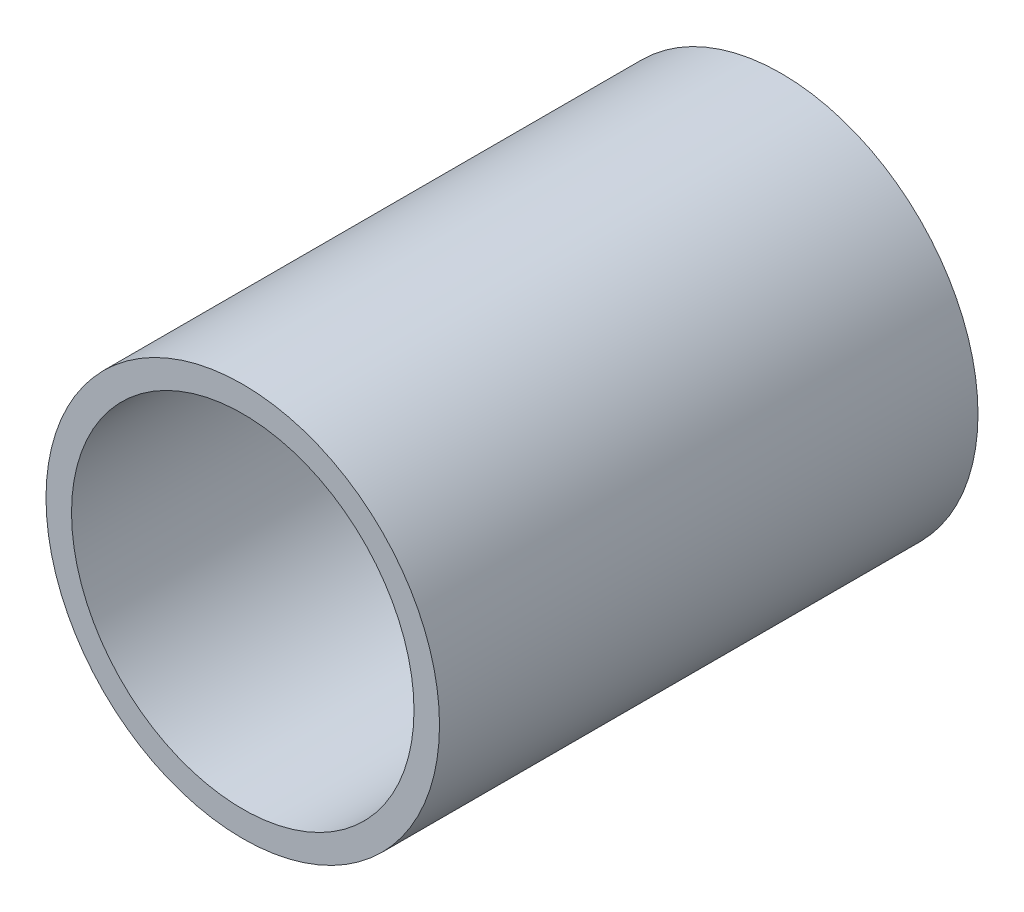
ISO-10303-21;
HEADER;
FILE_DESCRIPTION(('STEP AP214'),'2;1');
FILE_NAME('part.step','',(''),(''),'','','');
FILE_SCHEMA(('AUTOMOTIVE_DESIGN { 1 0 10303 214 1 1 1 1 }'));
ENDSEC;
DATA;
#1=APPLICATION_CONTEXT('core data for automotive mechanical design processes');
#2=APPLICATION_PROTOCOL_DEFINITION('international standard','automotive_design',2000,#1);
#3=PRODUCT_CONTEXT('',#1,'mechanical');
#4=PRODUCT('Part','Part','',(#3));
#5=PRODUCT_RELATED_PRODUCT_CATEGORY('part','',(#4));
#6=PRODUCT_DEFINITION_FORMATION('','',#4);
#7=PRODUCT_DEFINITION_CONTEXT('part definition',#1,'design');
#8=PRODUCT_DEFINITION('design','',#6,#7);
#9=PRODUCT_DEFINITION_SHAPE('','',#8);
#10=(LENGTH_UNIT() NAMED_UNIT(*) SI_UNIT(.MILLI.,.METRE.));
#11=(NAMED_UNIT(*) PLANE_ANGLE_UNIT() SI_UNIT($,.RADIAN.));
#12=(NAMED_UNIT(*) SI_UNIT($,.STERADIAN.) SOLID_ANGLE_UNIT());
#13=UNCERTAINTY_MEASURE_WITH_UNIT(LENGTH_MEASURE(1.E-05),#10,'distance_accuracy_value','');
#14=(GEOMETRIC_REPRESENTATION_CONTEXT(3) GLOBAL_UNCERTAINTY_ASSIGNED_CONTEXT((#13)) GLOBAL_UNIT_ASSIGNED_CONTEXT((#10,
#11,#12)) REPRESENTATION_CONTEXT('',''));
#15=CARTESIAN_POINT('',(0.,0.,0.));
#16=DIRECTION('',(0.,0.,1.));
#17=DIRECTION('',(1.,0.,0.));
#18=AXIS2_PLACEMENT_3D('',#15,#16,#17);
#19=CARTESIAN_POINT('',(0.,0.,82.55));
#20=DIRECTION('',(0.,0.,1.));
#21=DIRECTION('',(1.,0.,0.));
#22=AXIS2_PLACEMENT_3D('',#19,#20,#21);
#23=PLANE('',#22);
#24=CARTESIAN_POINT('',(0.,0.,82.55));
#25=DIRECTION('',(0.,0.,1.));
#26=DIRECTION('',(1.,0.,0.));
#27=AXIS2_PLACEMENT_3D('',#24,#25,#26);
#28=CIRCLE('',#27,30.1625);
#29=CARTESIAN_POINT('',(30.1625,0.,82.55));
#30=VERTEX_POINT('',#29);
#31=EDGE_CURVE('E10',#30,#30,#28,.T.);
#32=ORIENTED_EDGE('',*,*,#31,.T.);
#33=EDGE_LOOP('',(#32));
#34=FACE_BOUND('',#33,.T.);
#35=CARTESIAN_POINT('',(0.,0.,82.55));
#36=DIRECTION('',(0.,0.,1.));
#37=DIRECTION('',(1.,0.,0.));
#38=AXIS2_PLACEMENT_3D('',#35,#36,#37);
#39=CIRCLE('',#38,26.2509);
#40=CARTESIAN_POINT('',(26.2509,0.,82.55));
#41=VERTEX_POINT('',#40);
#42=EDGE_CURVE('E54',#41,#41,#39,.T.);
#43=ORIENTED_EDGE('',*,*,#42,.F.);
#44=EDGE_LOOP('',(#43));
#45=FACE_BOUND('',#44,.T.);
#46=ADVANCED_FACE('F41',(#34,#45),#23,.T.);
#47=CARTESIAN_POINT('',(0.,0.,0.));
#48=DIRECTION('',(0.,0.,1.));
#49=DIRECTION('',(1.,0.,0.));
#50=AXIS2_PLACEMENT_3D('',#47,#48,#49);
#51=PLANE('',#50);
#52=CARTESIAN_POINT('',(0.,0.,0.));
#53=DIRECTION('',(0.,0.,1.));
#54=DIRECTION('',(1.,0.,0.));
#55=AXIS2_PLACEMENT_3D('',#52,#53,#54);
#56=CIRCLE('',#55,30.1625);
#57=CARTESIAN_POINT('',(30.1625,0.,0.));
#58=VERTEX_POINT('',#57);
#59=EDGE_CURVE('E45',#58,#58,#56,.T.);
#60=ORIENTED_EDGE('',*,*,#59,.F.);
#61=EDGE_LOOP('',(#60));
#62=FACE_BOUND('',#61,.T.);
#63=CARTESIAN_POINT('',(0.,0.,0.));
#64=DIRECTION('',(0.,0.,1.));
#65=DIRECTION('',(1.,0.,0.));
#66=AXIS2_PLACEMENT_3D('',#63,#64,#65);
#67=CIRCLE('',#66,26.2509);
#68=CARTESIAN_POINT('',(26.2509,0.,0.));
#69=VERTEX_POINT('',#68);
#70=EDGE_CURVE('E56',#69,#69,#67,.T.);
#71=ORIENTED_EDGE('',*,*,#70,.T.);
#72=EDGE_LOOP('',(#71));
#73=FACE_BOUND('',#72,.T.);
#74=ADVANCED_FACE('F68',(#62,#73),#51,.F.);
#75=CARTESIAN_POINT('',(0.,0.,82.55));
#76=DIRECTION('',(0.,0.,-1.));
#77=DIRECTION('',(-1.,0.,0.));
#78=AXIS2_PLACEMENT_3D('',#75,#76,#77);
#79=CYLINDRICAL_SURFACE('',#78,30.1625);
#80=ORIENTED_EDGE('',*,*,#31,.F.);
#81=EDGE_LOOP('',(#80));
#82=FACE_BOUND('',#81,.T.);
#83=ORIENTED_EDGE('',*,*,#59,.T.);
#84=EDGE_LOOP('',(#83));
#85=FACE_BOUND('',#84,.T.);
#86=ADVANCED_FACE('F43',(#82,#85),#79,.T.);
#87=CARTESIAN_POINT('',(0.,0.,82.55));
#88=DIRECTION('',(0.,0.,-1.));
#89=DIRECTION('',(-1.,0.,0.));
#90=AXIS2_PLACEMENT_3D('',#87,#88,#89);
#91=CYLINDRICAL_SURFACE('',#90,26.2509);
#92=ORIENTED_EDGE('',*,*,#42,.T.);
#93=EDGE_LOOP('',(#92));
#94=FACE_BOUND('',#93,.T.);
#95=ORIENTED_EDGE('',*,*,#70,.F.);
#96=EDGE_LOOP('',(#95));
#97=FACE_BOUND('',#96,.T.);
#98=ADVANCED_FACE('F64',(#94,#97),#91,.F.);
#99=CLOSED_SHELL('',(#46,#74,#86,#98));
#100=MANIFOLD_SOLID_BREP('B2',#99);
#101=ADVANCED_BREP_SHAPE_REPRESENTATION('',(#18,#100),#14);
#102=SHAPE_DEFINITION_REPRESENTATION(#9,#101);
ENDSEC;
END-ISO-10303-21;
